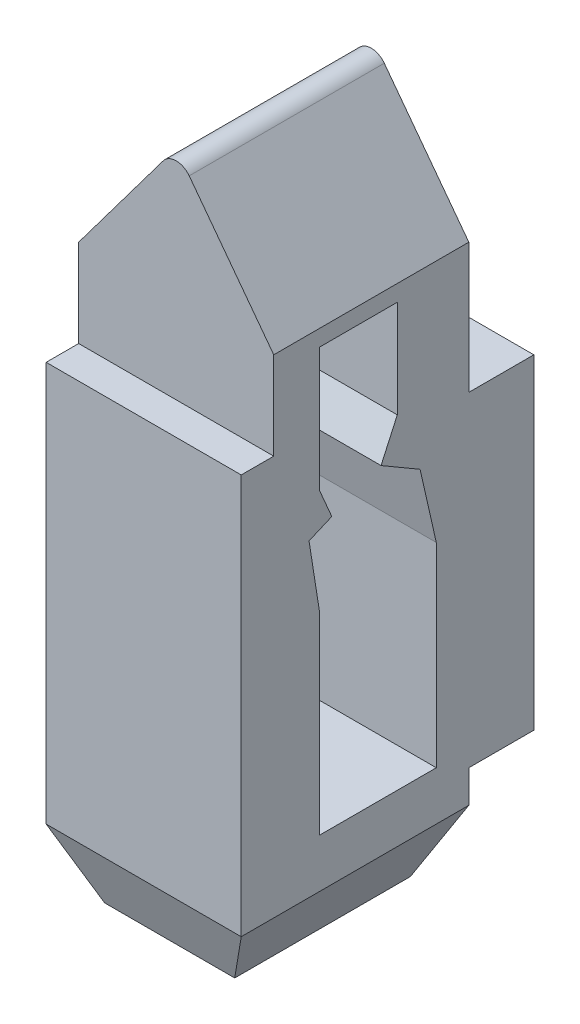
ISO-10303-21;
HEADER;
FILE_DESCRIPTION(('STEP AP214'),'2;1');
FILE_NAME('part.step','',(''),(''),'','','');
FILE_SCHEMA(('AUTOMOTIVE_DESIGN { 1 0 10303 214 1 1 1 1 }'));
ENDSEC;
DATA;
#1=APPLICATION_CONTEXT('core data for automotive mechanical design processes');
#2=APPLICATION_PROTOCOL_DEFINITION('international standard','automotive_design',2000,#1);
#3=PRODUCT_CONTEXT('',#1,'mechanical');
#4=PRODUCT('Part','Part','',(#3));
#5=PRODUCT_RELATED_PRODUCT_CATEGORY('part','',(#4));
#6=PRODUCT_DEFINITION_FORMATION('','',#4);
#7=PRODUCT_DEFINITION_CONTEXT('part definition',#1,'design');
#8=PRODUCT_DEFINITION('design','',#6,#7);
#9=PRODUCT_DEFINITION_SHAPE('','',#8);
#10=(LENGTH_UNIT() NAMED_UNIT(*) SI_UNIT(.MILLI.,.METRE.));
#11=(NAMED_UNIT(*) PLANE_ANGLE_UNIT() SI_UNIT($,.RADIAN.));
#12=(NAMED_UNIT(*) SI_UNIT($,.STERADIAN.) SOLID_ANGLE_UNIT());
#13=UNCERTAINTY_MEASURE_WITH_UNIT(LENGTH_MEASURE(1.E-05),#10,'distance_accuracy_value','');
#14=(GEOMETRIC_REPRESENTATION_CONTEXT(3) GLOBAL_UNCERTAINTY_ASSIGNED_CONTEXT((#13)) GLOBAL_UNIT_ASSIGNED_CONTEXT((#10,
#11,#12)) REPRESENTATION_CONTEXT('',''));
#15=CARTESIAN_POINT('',(0.,0.,0.));
#16=DIRECTION('',(0.,0.,1.));
#17=DIRECTION('',(1.,0.,0.));
#18=AXIS2_PLACEMENT_3D('',#15,#16,#17);
#19=CARTESIAN_POINT('',(-3.,2.,0.));
#20=DIRECTION('',(0.,0.371390676354104,0.928476690885259));
#21=DIRECTION('',(1.,0.,0.));
#22=AXIS2_PLACEMENT_3D('',#19,#20,#21);
#23=PLANE('',#22);
#24=DIRECTION('',(1.,0.,0.));
#25=VECTOR('',#24,1.);
#26=CARTESIAN_POINT('',(0.,2.,0.));
#27=LINE('',#26,#25);
#28=CARTESIAN_POINT('',(-3.,2.,0.));
#29=VERTEX_POINT('',#28);
#30=CARTESIAN_POINT('',(3.,2.,0.));
#31=VERTEX_POINT('',#30);
#32=EDGE_CURVE('E396',#29,#31,#27,.T.);
#33=ORIENTED_EDGE('',*,*,#32,.T.);
#34=DIRECTION('',(-0.42107596053282,-0.84215192106664,0.336860768426856));
#35=VECTOR('',#34,1.);
#36=CARTESIAN_POINT('',(2.5,1.,0.4));
#37=LINE('',#36,#35);
#38=CARTESIAN_POINT('',(2.,0.,0.8));
#39=VERTEX_POINT('',#38);
#40=EDGE_CURVE('E381',#31,#39,#37,.T.);
#41=ORIENTED_EDGE('',*,*,#40,.T.);
#42=DIRECTION('',(1.,0.,0.));
#43=VECTOR('',#42,1.);
#44=CARTESIAN_POINT('',(0.,0.,0.8));
#45=LINE('',#44,#43);
#46=CARTESIAN_POINT('',(-2.,0.,0.8));
#47=VERTEX_POINT('',#46);
#48=EDGE_CURVE('E27',#47,#39,#45,.T.);
#49=ORIENTED_EDGE('',*,*,#48,.F.);
#50=DIRECTION('',(0.42107596053282,-0.84215192106664,0.336860768426856));
#51=VECTOR('',#50,1.);
#52=CARTESIAN_POINT('',(-2.5,1.,0.4));
#53=LINE('',#52,#51);
#54=EDGE_CURVE('E484',#29,#47,#53,.T.);
#55=ORIENTED_EDGE('',*,*,#54,.F.);
#56=EDGE_LOOP('',(#33,#41,#49,#55));
#57=FACE_BOUND('',#56,.T.);
#58=ADVANCED_FACE('F16',(#57),#23,.F.);
#59=CARTESIAN_POINT('',(-3.,2.,7.));
#60=DIRECTION('',(0.,-0.371390676354104,0.928476690885259));
#61=DIRECTION('',(-1.,0.,0.));
#62=AXIS2_PLACEMENT_3D('',#59,#60,#61);
#63=PLANE('',#62);
#64=DIRECTION('',(0.42107596053282,-0.84215192106664,-0.336860768426856));
#65=VECTOR('',#64,1.);
#66=CARTESIAN_POINT('',(-2.5,1.,6.6));
#67=LINE('',#66,#65);
#68=CARTESIAN_POINT('',(-3.,2.,7.));
#69=VERTEX_POINT('',#68);
#70=CARTESIAN_POINT('',(-2.,0.,6.2));
#71=VERTEX_POINT('',#70);
#72=EDGE_CURVE('E382',#69,#71,#67,.T.);
#73=ORIENTED_EDGE('',*,*,#72,.T.);
#74=DIRECTION('',(1.,0.,0.));
#75=VECTOR('',#74,1.);
#76=CARTESIAN_POINT('',(0.,0.,6.2));
#77=LINE('',#76,#75);
#78=CARTESIAN_POINT('',(2.,0.,6.2));
#79=VERTEX_POINT('',#78);
#80=EDGE_CURVE('E11',#71,#79,#77,.T.);
#81=ORIENTED_EDGE('',*,*,#80,.T.);
#82=DIRECTION('',(-0.42107596053282,-0.84215192106664,-0.336860768426856));
#83=VECTOR('',#82,1.);
#84=CARTESIAN_POINT('',(2.5,1.,6.6));
#85=LINE('',#84,#83);
#86=CARTESIAN_POINT('',(3.,2.,7.));
#87=VERTEX_POINT('',#86);
#88=EDGE_CURVE('E605',#87,#79,#85,.T.);
#89=ORIENTED_EDGE('',*,*,#88,.F.);
#90=DIRECTION('',(1.,0.,0.));
#91=VECTOR('',#90,1.);
#92=CARTESIAN_POINT('',(0.,2.,7.));
#93=LINE('',#92,#91);
#94=EDGE_CURVE('E377',#69,#87,#93,.T.);
#95=ORIENTED_EDGE('',*,*,#94,.F.);
#96=EDGE_LOOP('',(#73,#81,#89,#95));
#97=FACE_BOUND('',#96,.T.);
#98=ADVANCED_FACE('F695',(#97),#63,.T.);
#99=CARTESIAN_POINT('',(-2.,0.,0.));
#100=DIRECTION('',(0.,-1.,0.));
#101=DIRECTION('',(0.,0.,-1.));
#102=AXIS2_PLACEMENT_3D('',#99,#100,#101);
#103=PLANE('',#102);
#104=ORIENTED_EDGE('',*,*,#48,.T.);
#105=DIRECTION('',(0.,0.,1.));
#106=VECTOR('',#105,1.);
#107=CARTESIAN_POINT('',(2.,0.,3.5));
#108=LINE('',#107,#106);
#109=EDGE_CURVE('E451',#39,#79,#108,.T.);
#110=ORIENTED_EDGE('',*,*,#109,.T.);
#111=ORIENTED_EDGE('',*,*,#80,.F.);
#112=DIRECTION('',(0.,0.,1.));
#113=VECTOR('',#112,1.);
#114=CARTESIAN_POINT('',(-2.,0.,3.5));
#115=LINE('',#114,#113);
#116=EDGE_CURVE('E446',#47,#71,#115,.T.);
#117=ORIENTED_EDGE('',*,*,#116,.F.);
#118=EDGE_LOOP('',(#104,#110,#111,#117));
#119=FACE_BOUND('',#118,.T.);
#120=ADVANCED_FACE('F709',(#119),#103,.T.);
#121=CARTESIAN_POINT('',(2.,0.,0.));
#122=DIRECTION('',(0.894427190999916,-0.447213595499958,0.));
#123=DIRECTION('',(0.,0.,-1.));
#124=AXIS2_PLACEMENT_3D('',#121,#122,#123);
#125=PLANE('',#124);
#126=ORIENTED_EDGE('',*,*,#40,.F.);
#127=DIRECTION('',(0.,0.,1.));
#128=VECTOR('',#127,1.);
#129=CARTESIAN_POINT('',(3.,2.,3.5));
#130=LINE('',#129,#128);
#131=EDGE_CURVE('E406',#31,#87,#130,.T.);
#132=ORIENTED_EDGE('',*,*,#131,.T.);
#133=ORIENTED_EDGE('',*,*,#88,.T.);
#134=ORIENTED_EDGE('',*,*,#109,.F.);
#135=EDGE_LOOP('',(#126,#132,#133,#134));
#136=FACE_BOUND('',#135,.T.);
#137=ADVANCED_FACE('F691',(#136),#125,.T.);
#138=CARTESIAN_POINT('',(0.,0.,7.));
#139=DIRECTION('',(0.,0.,1.));
#140=DIRECTION('',(1.,0.,0.));
#141=AXIS2_PLACEMENT_3D('',#138,#139,#140);
#142=PLANE('',#141);
#143=DIRECTION('',(0.,1.,0.));
#144=VECTOR('',#143,1.);
#145=CARTESIAN_POINT('',(3.,8.15,7.));
#146=LINE('',#145,#144);
#147=CARTESIAN_POINT('',(3.,14.3,7.));
#148=VERTEX_POINT('',#147);
#149=EDGE_CURVE('E403',#87,#148,#146,.T.);
#150=ORIENTED_EDGE('',*,*,#149,.T.);
#151=DIRECTION('',(-1.,0.,0.));
#152=VECTOR('',#151,1.);
#153=CARTESIAN_POINT('',(0.,14.3,7.));
#154=LINE('',#153,#152);
#155=CARTESIAN_POINT('',(-3.,14.3,7.));
#156=VERTEX_POINT('',#155);
#157=EDGE_CURVE('E373',#148,#156,#154,.T.);
#158=ORIENTED_EDGE('',*,*,#157,.T.);
#159=DIRECTION('',(0.,-1.,0.));
#160=VECTOR('',#159,1.);
#161=CARTESIAN_POINT('',(-3.,8.15,7.));
#162=LINE('',#161,#160);
#163=EDGE_CURVE('E459',#156,#69,#162,.T.);
#164=ORIENTED_EDGE('',*,*,#163,.T.);
#165=ORIENTED_EDGE('',*,*,#94,.T.);
#166=EDGE_LOOP('',(#150,#158,#164,#165));
#167=FACE_BOUND('',#166,.T.);
#168=ADVANCED_FACE('F698',(#167),#142,.T.);
#169=CARTESIAN_POINT('',(-3.,2.,0.));
#170=DIRECTION('',(-0.894427190999916,-0.447213595499958,0.));
#171=DIRECTION('',(-0.447213595499958,0.894427190999916,0.));
#172=AXIS2_PLACEMENT_3D('',#169,#170,#171);
#173=PLANE('',#172);
#174=ORIENTED_EDGE('',*,*,#54,.T.);
#175=ORIENTED_EDGE('',*,*,#116,.T.);
#176=ORIENTED_EDGE('',*,*,#72,.F.);
#177=DIRECTION('',(0.,0.,1.));
#178=VECTOR('',#177,1.);
#179=CARTESIAN_POINT('',(-3.,2.,3.5));
#180=LINE('',#179,#178);
#181=EDGE_CURVE('E547',#29,#69,#180,.T.);
#182=ORIENTED_EDGE('',*,*,#181,.F.);
#183=EDGE_LOOP('',(#174,#175,#176,#182));
#184=FACE_BOUND('',#183,.T.);
#185=ADVANCED_FACE('F706',(#184),#173,.T.);
#186=CARTESIAN_POINT('',(0.,0.,0.));
#187=DIRECTION('',(0.,0.,1.));
#188=DIRECTION('',(1.,0.,0.));
#189=AXIS2_PLACEMENT_3D('',#186,#187,#188);
#190=PLANE('',#189);
#191=ORIENTED_EDGE('',*,*,#32,.F.);
#192=DIRECTION('',(0.,-1.,0.));
#193=VECTOR('',#192,1.);
#194=CARTESIAN_POINT('',(-3.,2.5,0.));
#195=LINE('',#194,#193);
#196=CARTESIAN_POINT('',(-3.,3.,0.));
#197=VERTEX_POINT('',#196);
#198=EDGE_CURVE('E551',#197,#29,#195,.T.);
#199=ORIENTED_EDGE('',*,*,#198,.F.);
#200=DIRECTION('',(-1.,0.,0.));
#201=VECTOR('',#200,1.);
#202=CARTESIAN_POINT('',(-2.5,3.,0.));
#203=LINE('',#202,#201);
#204=CARTESIAN_POINT('',(-2.,3.,0.));
#205=VERTEX_POINT('',#204);
#206=EDGE_CURVE('E369',#205,#197,#203,.T.);
#207=ORIENTED_EDGE('',*,*,#206,.F.);
#208=DIRECTION('',(0.,-1.,0.));
#209=VECTOR('',#208,1.);
#210=CARTESIAN_POINT('',(-2.,7.,0.));
#211=LINE('',#210,#209);
#212=CARTESIAN_POINT('',(-2.,11.,0.));
#213=VERTEX_POINT('',#212);
#214=EDGE_CURVE('E465',#213,#205,#211,.T.);
#215=ORIENTED_EDGE('',*,*,#214,.F.);
#216=DIRECTION('',(-1.,0.,0.));
#217=VECTOR('',#216,1.);
#218=CARTESIAN_POINT('',(0.,11.,0.));
#219=LINE('',#218,#217);
#220=CARTESIAN_POINT('',(2.,11.,0.));
#221=VERTEX_POINT('',#220);
#222=EDGE_CURVE('E387',#221,#213,#219,.T.);
#223=ORIENTED_EDGE('',*,*,#222,.F.);
#224=DIRECTION('',(0.,1.,0.));
#225=VECTOR('',#224,1.);
#226=CARTESIAN_POINT('',(2.,7.,0.));
#227=LINE('',#226,#225);
#228=CARTESIAN_POINT('',(2.,3.,0.));
#229=VERTEX_POINT('',#228);
#230=EDGE_CURVE('E493',#229,#221,#227,.T.);
#231=ORIENTED_EDGE('',*,*,#230,.F.);
#232=DIRECTION('',(-1.,0.,0.));
#233=VECTOR('',#232,1.);
#234=CARTESIAN_POINT('',(2.5,3.,0.));
#235=LINE('',#234,#233);
#236=CARTESIAN_POINT('',(3.,3.,0.));
#237=VERTEX_POINT('',#236);
#238=EDGE_CURVE('E304',#237,#229,#235,.T.);
#239=ORIENTED_EDGE('',*,*,#238,.F.);
#240=DIRECTION('',(0.,1.,0.));
#241=VECTOR('',#240,1.);
#242=CARTESIAN_POINT('',(3.,2.5,0.));
#243=LINE('',#242,#241);
#244=EDGE_CURVE('E443',#31,#237,#243,.T.);
#245=ORIENTED_EDGE('',*,*,#244,.F.);
#246=EDGE_LOOP('',(#191,#199,#207,#215,#223,#231,#239,#245));
#247=FACE_BOUND('',#246,.T.);
#248=ADVANCED_FACE('F715',(#247),#190,.F.);
#249=CARTESIAN_POINT('',(0.,9.5,-1.5));
#250=DIRECTION('',(0.,-1.,0.));
#251=DIRECTION('',(1.,0.,0.));
#252=AXIS2_PLACEMENT_3D('',#249,#250,#251);
#253=CYLINDRICAL_SURFACE('',#252,0.5);
#254=DIRECTION('',(0.,-1.,0.));
#255=VECTOR('',#254,1.);
#256=CARTESIAN_POINT('',(0.5,9.5,-1.5));
#257=LINE('',#256,#255);
#258=CARTESIAN_POINT('',(0.5,11.,-1.5));
#259=VERTEX_POINT('',#258);
#260=CARTESIAN_POINT('',(0.5,8.,-1.5));
#261=VERTEX_POINT('',#260);
#262=EDGE_CURVE('E392',#259,#261,#257,.T.);
#263=ORIENTED_EDGE('',*,*,#262,.F.);
#264=CARTESIAN_POINT('',(0.,11.,-1.5));
#265=DIRECTION('',(0.,-1.,0.));
#266=DIRECTION('',(1.,0.,0.));
#267=AXIS2_PLACEMENT_3D('',#264,#265,#266);
#268=CIRCLE('',#267,0.5);
#269=CARTESIAN_POINT('',(-0.5,11.,-1.5));
#270=VERTEX_POINT('',#269);
#271=EDGE_CURVE('E306',#259,#270,#268,.T.);
#272=ORIENTED_EDGE('',*,*,#271,.T.);
#273=DIRECTION('',(0.,-1.,0.));
#274=VECTOR('',#273,1.);
#275=CARTESIAN_POINT('',(-0.5,9.5,-1.5));
#276=LINE('',#275,#274);
#277=CARTESIAN_POINT('',(-0.5,8.,-1.5));
#278=VERTEX_POINT('',#277);
#279=EDGE_CURVE('E397',#270,#278,#276,.T.);
#280=ORIENTED_EDGE('',*,*,#279,.T.);
#281=CARTESIAN_POINT('',(0.,8.,-1.5));
#282=DIRECTION('',(0.,-1.,0.));
#283=DIRECTION('',(1.,0.,0.));
#284=AXIS2_PLACEMENT_3D('',#281,#282,#283);
#285=CIRCLE('',#284,0.5);
#286=EDGE_CURVE('E545',#261,#278,#285,.T.);
#287=ORIENTED_EDGE('',*,*,#286,.F.);
#288=EDGE_LOOP('',(#263,#272,#280,#287));
#289=FACE_BOUND('',#288,.T.);
#290=ADVANCED_FACE('F18',(#289),#253,.T.);
#291=CARTESIAN_POINT('',(0.,9.5,-1.5));
#292=DIRECTION('',(0.,-1.,0.));
#293=DIRECTION('',(1.,0.,0.));
#294=AXIS2_PLACEMENT_3D('',#291,#292,#293);
#295=CYLINDRICAL_SURFACE('',#294,0.5);
#296=ORIENTED_EDGE('',*,*,#279,.F.);
#297=CARTESIAN_POINT('',(0.,11.,-1.5));
#298=DIRECTION('',(0.,-1.,0.));
#299=DIRECTION('',(1.,0.,0.));
#300=AXIS2_PLACEMENT_3D('',#297,#298,#299);
#301=CIRCLE('',#300,0.5);
#302=CARTESIAN_POINT('',(0.,11.,-2.));
#303=VERTEX_POINT('',#302);
#304=EDGE_CURVE('E311',#270,#303,#301,.T.);
#305=ORIENTED_EDGE('',*,*,#304,.T.);
#306=CARTESIAN_POINT('',(0.,11.,-1.5));
#307=DIRECTION('',(0.,-1.,0.));
#308=DIRECTION('',(1.,0.,0.));
#309=AXIS2_PLACEMENT_3D('',#306,#307,#308);
#310=CIRCLE('',#309,0.5);
#311=EDGE_CURVE('E310',#303,#259,#310,.T.);
#312=ORIENTED_EDGE('',*,*,#311,.T.);
#313=ORIENTED_EDGE('',*,*,#262,.T.);
#314=CARTESIAN_POINT('',(0.,8.,-1.5));
#315=DIRECTION('',(0.,-1.,0.));
#316=DIRECTION('',(1.,0.,0.));
#317=AXIS2_PLACEMENT_3D('',#314,#315,#316);
#318=CIRCLE('',#317,0.5);
#319=EDGE_CURVE('E523',#278,#261,#318,.T.);
#320=ORIENTED_EDGE('',*,*,#319,.F.);
#321=EDGE_LOOP('',(#296,#305,#312,#313,#320));
#322=FACE_BOUND('',#321,.T.);
#323=ADVANCED_FACE('F1038',(#322),#295,.T.);
#324=CARTESIAN_POINT('',(0.,8.,0.));
#325=DIRECTION('',(0.,-1.,0.));
#326=DIRECTION('',(0.,0.,-1.));
#327=AXIS2_PLACEMENT_3D('',#324,#325,#326);
#328=PLANE('',#327);
#329=ORIENTED_EDGE('',*,*,#286,.T.);
#330=ORIENTED_EDGE('',*,*,#319,.T.);
#331=EDGE_LOOP('',(#329,#330));
#332=FACE_BOUND('',#331,.T.);
#333=ADVANCED_FACE('F995',(#332),#328,.T.);
#334=CARTESIAN_POINT('',(-3.,13.,0.));
#335=DIRECTION('',(0.,1.,0.));
#336=DIRECTION('',(1.,0.,0.));
#337=AXIS2_PLACEMENT_3D('',#334,#335,#336);
#338=PLANE('',#337);
#339=DIRECTION('',(0.,0.,-1.));
#340=VECTOR('',#339,1.);
#341=CARTESIAN_POINT('',(-3.,13.,-1.));
#342=LINE('',#341,#340);
#343=CARTESIAN_POINT('',(-3.,13.,0.));
#344=VERTEX_POINT('',#343);
#345=CARTESIAN_POINT('',(-3.,13.,-2.));
#346=VERTEX_POINT('',#345);
#347=EDGE_CURVE('E346',#344,#346,#342,.T.);
#348=ORIENTED_EDGE('',*,*,#347,.F.);
#349=DIRECTION('',(1.,0.,0.));
#350=VECTOR('',#349,1.);
#351=CARTESIAN_POINT('',(0.,13.,0.));
#352=LINE('',#351,#350);
#353=CARTESIAN_POINT('',(3.,13.,0.));
#354=VERTEX_POINT('',#353);
#355=EDGE_CURVE('E542',#344,#354,#352,.T.);
#356=ORIENTED_EDGE('',*,*,#355,.T.);
#357=DIRECTION('',(0.,0.,-1.));
#358=VECTOR('',#357,1.);
#359=CARTESIAN_POINT('',(3.,13.,-1.));
#360=LINE('',#359,#358);
#361=CARTESIAN_POINT('',(3.,13.,-2.));
#362=VERTEX_POINT('',#361);
#363=EDGE_CURVE('E345',#354,#362,#360,.T.);
#364=ORIENTED_EDGE('',*,*,#363,.T.);
#365=DIRECTION('',(1.,0.,0.));
#366=VECTOR('',#365,1.);
#367=CARTESIAN_POINT('',(0.,13.,-2.));
#368=LINE('',#367,#366);
#369=EDGE_CURVE('E546',#346,#362,#368,.T.);
#370=ORIENTED_EDGE('',*,*,#369,.F.);
#371=EDGE_LOOP('',(#348,#356,#364,#370));
#372=FACE_BOUND('',#371,.T.);
#373=ADVANCED_FACE('F740',(#372),#338,.T.);
#374=CARTESIAN_POINT('',(0.,0.,0.));
#375=DIRECTION('',(0.,0.,1.));
#376=DIRECTION('',(1.,0.,0.));
#377=AXIS2_PLACEMENT_3D('',#374,#375,#376);
#378=PLANE('',#377);
#379=ORIENTED_EDGE('',*,*,#355,.F.);
#380=DIRECTION('',(0.,-1.,0.));
#381=VECTOR('',#380,1.);
#382=CARTESIAN_POINT('',(-3.,15.,0.));
#383=LINE('',#382,#381);
#384=CARTESIAN_POINT('',(-3.,17.,0.));
#385=VERTEX_POINT('',#384);
#386=EDGE_CURVE('E298',#385,#344,#383,.T.);
#387=ORIENTED_EDGE('',*,*,#386,.F.);
#388=DIRECTION('',(-0.6,-0.8,0.));
#389=VECTOR('',#388,1.);
#390=CARTESIAN_POINT('',(-1.7,18.7333333333,0.));
#391=LINE('',#390,#389);
#392=CARTESIAN_POINT('',(-0.4,20.4666666667,0.));
#393=VERTEX_POINT('',#392);
#394=EDGE_CURVE('E351',#393,#385,#391,.T.);
#395=ORIENTED_EDGE('',*,*,#394,.F.);
#396=CARTESIAN_POINT('',(0.,20.1666666667,0.));
#397=DIRECTION('',(0.,0.,1.));
#398=DIRECTION('',(1.,0.,0.));
#399=AXIS2_PLACEMENT_3D('',#396,#397,#398);
#400=CIRCLE('',#399,0.5);
#401=CARTESIAN_POINT('',(0.4,20.4666666667,0.));
#402=VERTEX_POINT('',#401);
#403=EDGE_CURVE('E364',#402,#393,#400,.T.);
#404=ORIENTED_EDGE('',*,*,#403,.F.);
#405=DIRECTION('',(-0.6,0.8,0.));
#406=VECTOR('',#405,1.);
#407=CARTESIAN_POINT('',(1.7,18.7333333333,0.));
#408=LINE('',#407,#406);
#409=CARTESIAN_POINT('',(3.,17.,0.));
#410=VERTEX_POINT('',#409);
#411=EDGE_CURVE('E541',#410,#402,#408,.T.);
#412=ORIENTED_EDGE('',*,*,#411,.F.);
#413=DIRECTION('',(0.,1.,0.));
#414=VECTOR('',#413,1.);
#415=CARTESIAN_POINT('',(3.,15.,0.));
#416=LINE('',#415,#414);
#417=EDGE_CURVE('E323',#354,#410,#416,.T.);
#418=ORIENTED_EDGE('',*,*,#417,.F.);
#419=EDGE_LOOP('',(#379,#387,#395,#404,#412,#418));
#420=FACE_BOUND('',#419,.T.);
#421=ADVANCED_FACE('F737',(#420),#378,.F.);
#422=CARTESIAN_POINT('',(0.,0.,-2.));
#423=DIRECTION('',(0.,0.,-1.));
#424=DIRECTION('',(0.,-1.,0.));
#425=AXIS2_PLACEMENT_3D('',#422,#423,#424);
#426=PLANE('',#425);
#427=DIRECTION('',(0.,1.,0.));
#428=VECTOR('',#427,1.);
#429=CARTESIAN_POINT('',(-3.,8.,-2.));
#430=LINE('',#429,#428);
#431=CARTESIAN_POINT('',(-3.,3.,-2.));
#432=VERTEX_POINT('',#431);
#433=EDGE_CURVE('E341',#432,#346,#430,.T.);
#434=ORIENTED_EDGE('',*,*,#433,.T.);
#435=ORIENTED_EDGE('',*,*,#369,.T.);
#436=DIRECTION('',(0.,-1.,0.));
#437=VECTOR('',#436,1.);
#438=CARTESIAN_POINT('',(3.,8.,-2.));
#439=LINE('',#438,#437);
#440=CARTESIAN_POINT('',(3.,3.,-2.));
#441=VERTEX_POINT('',#440);
#442=EDGE_CURVE('E526',#362,#441,#439,.T.);
#443=ORIENTED_EDGE('',*,*,#442,.T.);
#444=DIRECTION('',(-1.,0.,0.));
#445=VECTOR('',#444,1.);
#446=CARTESIAN_POINT('',(2.5,3.,-2.));
#447=LINE('',#446,#445);
#448=CARTESIAN_POINT('',(2.,3.,-2.));
#449=VERTEX_POINT('',#448);
#450=EDGE_CURVE('E300',#441,#449,#447,.T.);
#451=ORIENTED_EDGE('',*,*,#450,.T.);
#452=DIRECTION('',(0.,1.,0.));
#453=VECTOR('',#452,1.);
#454=CARTESIAN_POINT('',(2.,7.,-2.));
#455=LINE('',#454,#453);
#456=CARTESIAN_POINT('',(2.,11.,-2.));
#457=VERTEX_POINT('',#456);
#458=EDGE_CURVE('E455',#449,#457,#455,.T.);
#459=ORIENTED_EDGE('',*,*,#458,.T.);
#460=DIRECTION('',(-1.,0.,0.));
#461=VECTOR('',#460,1.);
#462=CARTESIAN_POINT('',(1.,11.,-2.));
#463=LINE('',#462,#461);
#464=EDGE_CURVE('E419',#457,#303,#463,.T.);
#465=ORIENTED_EDGE('',*,*,#464,.T.);
#466=DIRECTION('',(-1.,0.,0.));
#467=VECTOR('',#466,1.);
#468=CARTESIAN_POINT('',(-1.,11.,-2.));
#469=LINE('',#468,#467);
#470=CARTESIAN_POINT('',(-2.,11.,-2.));
#471=VERTEX_POINT('',#470);
#472=EDGE_CURVE('E383',#303,#471,#469,.T.);
#473=ORIENTED_EDGE('',*,*,#472,.T.);
#474=DIRECTION('',(0.,-1.,0.));
#475=VECTOR('',#474,1.);
#476=CARTESIAN_POINT('',(-2.,7.,-2.));
#477=LINE('',#476,#475);
#478=CARTESIAN_POINT('',(-2.,3.,-2.));
#479=VERTEX_POINT('',#478);
#480=EDGE_CURVE('E625',#471,#479,#477,.T.);
#481=ORIENTED_EDGE('',*,*,#480,.T.);
#482=DIRECTION('',(-1.,0.,0.));
#483=VECTOR('',#482,1.);
#484=CARTESIAN_POINT('',(-2.5,3.,-2.));
#485=LINE('',#484,#483);
#486=EDGE_CURVE('E372',#479,#432,#485,.T.);
#487=ORIENTED_EDGE('',*,*,#486,.T.);
#488=EDGE_LOOP('',(#434,#435,#443,#451,#459,#465,#473,#481,#487));
#489=FACE_BOUND('',#488,.T.);
#490=ADVANCED_FACE('F632',(#489),#426,.T.);
#491=CARTESIAN_POINT('',(3.,3.,0.));
#492=DIRECTION('',(0.,-1.,0.));
#493=DIRECTION('',(0.,0.,-1.));
#494=AXIS2_PLACEMENT_3D('',#491,#492,#493);
#495=PLANE('',#494);
#496=DIRECTION('',(0.,0.,-1.));
#497=VECTOR('',#496,1.);
#498=CARTESIAN_POINT('',(-2.,3.,-1.));
#499=LINE('',#498,#497);
#500=EDGE_CURVE('E469',#205,#479,#499,.T.);
#501=ORIENTED_EDGE('',*,*,#500,.F.);
#502=ORIENTED_EDGE('',*,*,#206,.T.);
#503=DIRECTION('',(0.,0.,-1.));
#504=VECTOR('',#503,1.);
#505=CARTESIAN_POINT('',(-3.,3.,-1.));
#506=LINE('',#505,#504);
#507=EDGE_CURVE('E402',#197,#432,#506,.T.);
#508=ORIENTED_EDGE('',*,*,#507,.T.);
#509=ORIENTED_EDGE('',*,*,#486,.F.);
#510=EDGE_LOOP('',(#501,#502,#508,#509));
#511=FACE_BOUND('',#510,.T.);
#512=ADVANCED_FACE('F642',(#511),#495,.T.);
#513=CARTESIAN_POINT('',(-3.,14.3,6.));
#514=DIRECTION('',(0.,-1.,0.));
#515=DIRECTION('',(0.,0.,-1.));
#516=AXIS2_PLACEMENT_3D('',#513,#514,#515);
#517=PLANE('',#516);
#518=DIRECTION('',(0.,0.,1.));
#519=VECTOR('',#518,1.);
#520=CARTESIAN_POINT('',(3.,14.3,6.5));
#521=LINE('',#520,#519);
#522=CARTESIAN_POINT('',(3.,14.3,6.));
#523=VERTEX_POINT('',#522);
#524=EDGE_CURVE('E407',#523,#148,#521,.T.);
#525=ORIENTED_EDGE('',*,*,#524,.F.);
#526=DIRECTION('',(-1.,0.,0.));
#527=VECTOR('',#526,1.);
#528=CARTESIAN_POINT('',(0.,14.3,6.));
#529=LINE('',#528,#527);
#530=CARTESIAN_POINT('',(-3.,14.3,6.));
#531=VERTEX_POINT('',#530);
#532=EDGE_CURVE('E350',#523,#531,#529,.T.);
#533=ORIENTED_EDGE('',*,*,#532,.T.);
#534=DIRECTION('',(0.,0.,1.));
#535=VECTOR('',#534,1.);
#536=CARTESIAN_POINT('',(-3.,14.3,6.5));
#537=LINE('',#536,#535);
#538=EDGE_CURVE('E355',#531,#156,#537,.T.);
#539=ORIENTED_EDGE('',*,*,#538,.T.);
#540=ORIENTED_EDGE('',*,*,#157,.F.);
#541=EDGE_LOOP('',(#525,#533,#539,#540));
#542=FACE_BOUND('',#541,.T.);
#543=ADVANCED_FACE('F725',(#542),#517,.F.);
#544=CARTESIAN_POINT('',(0.,0.,6.));
#545=DIRECTION('',(0.,0.,1.));
#546=DIRECTION('',(1.,0.,0.));
#547=AXIS2_PLACEMENT_3D('',#544,#545,#546);
#548=PLANE('',#547);
#549=DIRECTION('',(0.,1.,0.));
#550=VECTOR('',#549,1.);
#551=CARTESIAN_POINT('',(3.,15.65,6.));
#552=LINE('',#551,#550);
#553=CARTESIAN_POINT('',(3.,17.,6.));
#554=VERTEX_POINT('',#553);
#555=EDGE_CURVE('E322',#523,#554,#552,.T.);
#556=ORIENTED_EDGE('',*,*,#555,.T.);
#557=DIRECTION('',(-0.6,0.8,0.));
#558=VECTOR('',#557,1.);
#559=CARTESIAN_POINT('',(1.7,18.7333333333,6.));
#560=LINE('',#559,#558);
#561=CARTESIAN_POINT('',(0.4,20.4666666667,6.));
#562=VERTEX_POINT('',#561);
#563=EDGE_CURVE('E538',#554,#562,#560,.T.);
#564=ORIENTED_EDGE('',*,*,#563,.T.);
#565=CARTESIAN_POINT('',(0.,20.1666666667,6.));
#566=DIRECTION('',(0.,0.,1.));
#567=DIRECTION('',(1.,0.,0.));
#568=AXIS2_PLACEMENT_3D('',#565,#566,#567);
#569=CIRCLE('',#568,0.5);
#570=CARTESIAN_POINT('',(-0.4,20.4666666667,6.));
#571=VERTEX_POINT('',#570);
#572=EDGE_CURVE('E611',#562,#571,#569,.T.);
#573=ORIENTED_EDGE('',*,*,#572,.T.);
#574=DIRECTION('',(-0.6,-0.8,0.));
#575=VECTOR('',#574,1.);
#576=CARTESIAN_POINT('',(-1.7,18.7333333333,6.));
#577=LINE('',#576,#575);
#578=CARTESIAN_POINT('',(-3.,17.,6.));
#579=VERTEX_POINT('',#578);
#580=EDGE_CURVE('E347',#571,#579,#577,.T.);
#581=ORIENTED_EDGE('',*,*,#580,.T.);
#582=DIRECTION('',(0.,-1.,0.));
#583=VECTOR('',#582,1.);
#584=CARTESIAN_POINT('',(-3.,15.65,6.));
#585=LINE('',#584,#583);
#586=EDGE_CURVE('E299',#579,#531,#585,.T.);
#587=ORIENTED_EDGE('',*,*,#586,.T.);
#588=ORIENTED_EDGE('',*,*,#532,.F.);
#589=EDGE_LOOP('',(#556,#564,#573,#581,#587,#588));
#590=FACE_BOUND('',#589,.T.);
#591=ADVANCED_FACE('F729',(#590),#548,.T.);
#592=CARTESIAN_POINT('',(-3.,17.,0.));
#593=DIRECTION('',(0.8,-0.6,0.));
#594=DIRECTION('',(0.,0.,-1.));
#595=AXIS2_PLACEMENT_3D('',#592,#593,#594);
#596=PLANE('',#595);
#597=DIRECTION('',(0.,0.,1.));
#598=VECTOR('',#597,1.);
#599=CARTESIAN_POINT('',(-0.4,20.4666666667,3.));
#600=LINE('',#599,#598);
#601=EDGE_CURVE('E368',#393,#571,#600,.T.);
#602=ORIENTED_EDGE('',*,*,#601,.F.);
#603=ORIENTED_EDGE('',*,*,#394,.T.);
#604=DIRECTION('',(0.,0.,1.));
#605=VECTOR('',#604,1.);
#606=CARTESIAN_POINT('',(-3.,17.,3.));
#607=LINE('',#606,#605);
#608=EDGE_CURVE('E295',#385,#579,#607,.T.);
#609=ORIENTED_EDGE('',*,*,#608,.T.);
#610=ORIENTED_EDGE('',*,*,#580,.F.);
#611=EDGE_LOOP('',(#602,#603,#609,#610));
#612=FACE_BOUND('',#611,.T.);
#613=ADVANCED_FACE('F733',(#612),#596,.F.);
#614=CARTESIAN_POINT('',(0.4,20.4666666667,0.));
#615=DIRECTION('',(-0.8,-0.6,0.));
#616=DIRECTION('',(-0.6,0.8,0.));
#617=AXIS2_PLACEMENT_3D('',#614,#615,#616);
#618=PLANE('',#617);
#619=DIRECTION('',(0.,0.,1.));
#620=VECTOR('',#619,1.);
#621=CARTESIAN_POINT('',(3.,17.,3.));
#622=LINE('',#621,#620);
#623=EDGE_CURVE('E318',#410,#554,#622,.T.);
#624=ORIENTED_EDGE('',*,*,#623,.F.);
#625=ORIENTED_EDGE('',*,*,#411,.T.);
#626=DIRECTION('',(0.,0.,1.));
#627=VECTOR('',#626,1.);
#628=CARTESIAN_POINT('',(0.4,20.4666666667,3.));
#629=LINE('',#628,#627);
#630=EDGE_CURVE('E303',#402,#562,#629,.T.);
#631=ORIENTED_EDGE('',*,*,#630,.T.);
#632=ORIENTED_EDGE('',*,*,#563,.F.);
#633=EDGE_LOOP('',(#624,#625,#631,#632));
#634=FACE_BOUND('',#633,.T.);
#635=ADVANCED_FACE('F879',(#634),#618,.F.);
#636=CARTESIAN_POINT('',(0.,20.1666666667,3.));
#637=DIRECTION('',(0.,0.,1.));
#638=DIRECTION('',(0.8,0.6,0.));
#639=AXIS2_PLACEMENT_3D('',#636,#637,#638);
#640=CYLINDRICAL_SURFACE('',#639,0.5);
#641=ORIENTED_EDGE('',*,*,#630,.F.);
#642=ORIENTED_EDGE('',*,*,#403,.T.);
#643=ORIENTED_EDGE('',*,*,#601,.T.);
#644=ORIENTED_EDGE('',*,*,#572,.F.);
#645=EDGE_LOOP('',(#641,#642,#643,#644));
#646=FACE_BOUND('',#645,.T.);
#647=ADVANCED_FACE('F874',(#646),#640,.T.);
#648=CARTESIAN_POINT('',(3.,3.,0.));
#649=DIRECTION('',(0.,-1.,0.));
#650=DIRECTION('',(0.,0.,-1.));
#651=AXIS2_PLACEMENT_3D('',#648,#649,#650);
#652=PLANE('',#651);
#653=DIRECTION('',(0.,0.,-1.));
#654=VECTOR('',#653,1.);
#655=CARTESIAN_POINT('',(3.,3.,-1.));
#656=LINE('',#655,#654);
#657=EDGE_CURVE('E567',#237,#441,#656,.T.);
#658=ORIENTED_EDGE('',*,*,#657,.F.);
#659=ORIENTED_EDGE('',*,*,#238,.T.);
#660=DIRECTION('',(0.,0.,-1.));
#661=VECTOR('',#660,1.);
#662=CARTESIAN_POINT('',(2.,3.,-1.));
#663=LINE('',#662,#661);
#664=EDGE_CURVE('E386',#229,#449,#663,.T.);
#665=ORIENTED_EDGE('',*,*,#664,.T.);
#666=ORIENTED_EDGE('',*,*,#450,.F.);
#667=EDGE_LOOP('',(#658,#659,#665,#666));
#668=FACE_BOUND('',#667,.T.);
#669=ADVANCED_FACE('F746',(#668),#652,.T.);
#670=CARTESIAN_POINT('',(2.,11.,0.));
#671=DIRECTION('',(1.,0.,0.));
#672=DIRECTION('',(0.,1.,0.));
#673=AXIS2_PLACEMENT_3D('',#670,#671,#672);
#674=PLANE('',#673);
#675=ORIENTED_EDGE('',*,*,#664,.F.);
#676=ORIENTED_EDGE('',*,*,#230,.T.);
#677=DIRECTION('',(0.,0.,-1.));
#678=VECTOR('',#677,1.);
#679=CARTESIAN_POINT('',(2.,11.,-1.));
#680=LINE('',#679,#678);
#681=EDGE_CURVE('E409',#221,#457,#680,.T.);
#682=ORIENTED_EDGE('',*,*,#681,.T.);
#683=ORIENTED_EDGE('',*,*,#458,.F.);
#684=EDGE_LOOP('',(#675,#676,#682,#683));
#685=FACE_BOUND('',#684,.T.);
#686=ADVANCED_FACE('F937',(#685),#674,.F.);
#687=CARTESIAN_POINT('',(2.,11.,0.));
#688=DIRECTION('',(0.,-1.,0.));
#689=DIRECTION('',(0.,0.,-1.));
#690=AXIS2_PLACEMENT_3D('',#687,#688,#689);
#691=PLANE('',#690);
#692=ORIENTED_EDGE('',*,*,#304,.F.);
#693=ORIENTED_EDGE('',*,*,#271,.F.);
#694=ORIENTED_EDGE('',*,*,#311,.F.);
#695=ORIENTED_EDGE('',*,*,#464,.F.);
#696=ORIENTED_EDGE('',*,*,#681,.F.);
#697=ORIENTED_EDGE('',*,*,#222,.T.);
#698=DIRECTION('',(0.,0.,-1.));
#699=VECTOR('',#698,1.);
#700=CARTESIAN_POINT('',(-2.,11.,-1.));
#701=LINE('',#700,#699);
#702=EDGE_CURVE('E470',#213,#471,#701,.T.);
#703=ORIENTED_EDGE('',*,*,#702,.T.);
#704=ORIENTED_EDGE('',*,*,#472,.F.);
#705=EDGE_LOOP('',(#692,#693,#694,#695,#696,#697,#703,#704));
#706=FACE_BOUND('',#705,.T.);
#707=ADVANCED_FACE('F942',(#706),#691,.T.);
#708=CARTESIAN_POINT('',(-2.,3.,0.));
#709=DIRECTION('',(-1.,0.,0.));
#710=DIRECTION('',(0.,0.,1.));
#711=AXIS2_PLACEMENT_3D('',#708,#709,#710);
#712=PLANE('',#711);
#713=ORIENTED_EDGE('',*,*,#702,.F.);
#714=ORIENTED_EDGE('',*,*,#214,.T.);
#715=ORIENTED_EDGE('',*,*,#500,.T.);
#716=ORIENTED_EDGE('',*,*,#480,.F.);
#717=EDGE_LOOP('',(#713,#714,#715,#716));
#718=FACE_BOUND('',#717,.T.);
#719=ADVANCED_FACE('F915',(#718),#712,.F.);
#720=CARTESIAN_POINT('',(3.,2.,0.));
#721=DIRECTION('',(1.,0.,0.));
#722=DIRECTION('',(0.,1.,0.));
#723=AXIS2_PLACEMENT_3D('',#720,#721,#722);
#724=PLANE('',#723);
#725=DIRECTION('',(0.,0.,-1.));
#726=VECTOR('',#725,1.);
#727=CARTESIAN_POINT('',(3.,16.5,3.4));
#728=LINE('',#727,#726);
#729=CARTESIAN_POINT('',(3.,16.5,4.6));
#730=VERTEX_POINT('',#729);
#731=CARTESIAN_POINT('',(3.,16.5,2.2));
#732=VERTEX_POINT('',#731);
#733=EDGE_CURVE('E474',#730,#732,#728,.T.);
#734=ORIENTED_EDGE('',*,*,#733,.T.);
#735=DIRECTION('',(0.,-1.,0.));
#736=VECTOR('',#735,1.);
#737=CARTESIAN_POINT('',(3.,15.,2.2));
#738=LINE('',#737,#736);
#739=CARTESIAN_POINT('',(3.,13.5,2.2));
#740=VERTEX_POINT('',#739);
#741=EDGE_CURVE('E398',#732,#740,#738,.T.);
#742=ORIENTED_EDGE('',*,*,#741,.T.);
#743=DIRECTION('',(0.,-0.910366477462742,0.413802944300882));
#744=VECTOR('',#743,1.);
#745=CARTESIAN_POINT('',(3.,12.95,2.45));
#746=LINE('',#745,#744);
#747=CARTESIAN_POINT('',(3.,12.4,2.7));
#748=VERTEX_POINT('',#747);
#749=EDGE_CURVE('E333',#740,#748,#746,.T.);
#750=ORIENTED_EDGE('',*,*,#749,.T.);
#751=DIRECTION('',(0.,-0.503871025524211,-0.863778900898361));
#752=VECTOR('',#751,1.);
#753=CARTESIAN_POINT('',(3.,12.05,2.1));
#754=LINE('',#753,#752);
#755=CARTESIAN_POINT('',(3.,11.7,1.5));
#756=VERTEX_POINT('',#755);
#757=EDGE_CURVE('E433',#748,#756,#754,.T.);
#758=ORIENTED_EDGE('',*,*,#757,.T.);
#759=DIRECTION('',(0.,-0.97513285579143,-0.221621103589098));
#760=VECTOR('',#759,1.);
#761=CARTESIAN_POINT('',(3.,10.6,1.25));
#762=LINE('',#761,#760);
#763=CARTESIAN_POINT('',(3.,9.5,1.));
#764=VERTEX_POINT('',#763);
#765=EDGE_CURVE('E583',#756,#764,#762,.T.);
#766=ORIENTED_EDGE('',*,*,#765,.T.);
#767=DIRECTION('',(0.,-1.,0.));
#768=VECTOR('',#767,1.);
#769=CARTESIAN_POINT('',(3.,6.5,1.));
#770=LINE('',#769,#768);
#771=CARTESIAN_POINT('',(3.,3.5,1.));
#772=VERTEX_POINT('',#771);
#773=EDGE_CURVE('E462',#764,#772,#770,.T.);
#774=ORIENTED_EDGE('',*,*,#773,.T.);
#775=DIRECTION('',(0.,0.,1.));
#776=VECTOR('',#775,1.);
#777=CARTESIAN_POINT('',(3.,3.5,2.8));
#778=LINE('',#777,#776);
#779=CARTESIAN_POINT('',(3.,3.5,4.6));
#780=VERTEX_POINT('',#779);
#781=EDGE_CURVE('E506',#772,#780,#778,.T.);
#782=ORIENTED_EDGE('',*,*,#781,.T.);
#783=DIRECTION('',(0.,1.,0.));
#784=VECTOR('',#783,1.);
#785=CARTESIAN_POINT('',(3.,6.5,4.6));
#786=LINE('',#785,#784);
#787=CARTESIAN_POINT('',(3.,9.5,4.6));
#788=VERTEX_POINT('',#787);
#789=EDGE_CURVE('E340',#780,#788,#786,.T.);
#790=ORIENTED_EDGE('',*,*,#789,.T.);
#791=DIRECTION('',(0.,0.987877125404495,0.155237833992078));
#792=VECTOR('',#791,1.);
#793=CARTESIAN_POINT('',(3.,10.5,4.75714285714));
#794=LINE('',#793,#792);
#795=CARTESIAN_POINT('',(3.,11.5,4.91428571429));
#796=VERTEX_POINT('',#795);
#797=EDGE_CURVE('E360',#788,#796,#794,.T.);
#798=ORIENTED_EDGE('',*,*,#797,.T.);
#799=DIRECTION('',(0.,0.393919298579047,-0.91914503001811));
#800=VECTOR('',#799,1.);
#801=CARTESIAN_POINT('',(3.,11.65,4.56428571429));
#802=LINE('',#801,#800);
#803=CARTESIAN_POINT('',(3.,11.8,4.21428571429));
#804=VERTEX_POINT('',#803);
#805=EDGE_CURVE('E312',#796,#804,#802,.T.);
#806=ORIENTED_EDGE('',*,*,#805,.T.);
#807=DIRECTION('',(0.,0.91914503001811,0.393919298579047));
#808=VECTOR('',#807,1.);
#809=CARTESIAN_POINT('',(3.,12.25,4.40714285714));
#810=LINE('',#809,#808);
#811=CARTESIAN_POINT('',(3.,12.7,4.6));
#812=VERTEX_POINT('',#811);
#813=EDGE_CURVE('E328',#804,#812,#810,.T.);
#814=ORIENTED_EDGE('',*,*,#813,.T.);
#815=DIRECTION('',(0.,1.,0.));
#816=VECTOR('',#815,1.);
#817=CARTESIAN_POINT('',(3.,14.6,4.6));
#818=LINE('',#817,#816);
#819=EDGE_CURVE('E552',#812,#730,#818,.T.);
#820=ORIENTED_EDGE('',*,*,#819,.T.);
#821=EDGE_LOOP('',(#734,#742,#750,#758,#766,#774,#782,#790,#798,#806,#814,#820));
#822=FACE_BOUND('',#821,.T.);
#823=ORIENTED_EDGE('',*,*,#363,.F.);
#824=ORIENTED_EDGE('',*,*,#417,.T.);
#825=ORIENTED_EDGE('',*,*,#623,.T.);
#826=ORIENTED_EDGE('',*,*,#555,.F.);
#827=ORIENTED_EDGE('',*,*,#524,.T.);
#828=ORIENTED_EDGE('',*,*,#149,.F.);
#829=ORIENTED_EDGE('',*,*,#131,.F.);
#830=ORIENTED_EDGE('',*,*,#244,.T.);
#831=ORIENTED_EDGE('',*,*,#657,.T.);
#832=ORIENTED_EDGE('',*,*,#442,.F.);
#833=EDGE_LOOP('',(#823,#824,#825,#826,#827,#828,#829,#830,#831,#832));
#834=FACE_BOUND('',#833,.T.);
#835=ADVANCED_FACE('F720',(#822,#834),#724,.T.);
#836=CARTESIAN_POINT('',(-3.,17.,0.));
#837=DIRECTION('',(-1.,0.,0.));
#838=DIRECTION('',(0.,0.,1.));
#839=AXIS2_PLACEMENT_3D('',#836,#837,#838);
#840=PLANE('',#839);
#841=DIRECTION('',(0.,1.,0.));
#842=VECTOR('',#841,1.);
#843=CARTESIAN_POINT('',(-3.,14.6,4.6));
#844=LINE('',#843,#842);
#845=CARTESIAN_POINT('',(-3.,12.7,4.6));
#846=VERTEX_POINT('',#845);
#847=CARTESIAN_POINT('',(-3.,16.5,4.6));
#848=VERTEX_POINT('',#847);
#849=EDGE_CURVE('E576',#846,#848,#844,.T.);
#850=ORIENTED_EDGE('',*,*,#849,.F.);
#851=DIRECTION('',(0.,0.91914503001811,0.393919298579047));
#852=VECTOR('',#851,1.);
#853=CARTESIAN_POINT('',(-3.,12.25,4.40714285714));
#854=LINE('',#853,#852);
#855=CARTESIAN_POINT('',(-3.,11.8,4.21428571429));
#856=VERTEX_POINT('',#855);
#857=EDGE_CURVE('E329',#856,#846,#854,.T.);
#858=ORIENTED_EDGE('',*,*,#857,.F.);
#859=DIRECTION('',(0.,0.393919298579047,-0.91914503001811));
#860=VECTOR('',#859,1.);
#861=CARTESIAN_POINT('',(-3.,11.65,4.56428571429));
#862=LINE('',#861,#860);
#863=CARTESIAN_POINT('',(-3.,11.5,4.91428571429));
#864=VERTEX_POINT('',#863);
#865=EDGE_CURVE('E358',#864,#856,#862,.T.);
#866=ORIENTED_EDGE('',*,*,#865,.F.);
#867=DIRECTION('',(0.,0.987877125404495,0.155237833992078));
#868=VECTOR('',#867,1.);
#869=CARTESIAN_POINT('',(-3.,10.5,4.75714285714));
#870=LINE('',#869,#868);
#871=CARTESIAN_POINT('',(-3.,9.5,4.6));
#872=VERTEX_POINT('',#871);
#873=EDGE_CURVE('E335',#872,#864,#870,.T.);
#874=ORIENTED_EDGE('',*,*,#873,.F.);
#875=DIRECTION('',(0.,1.,0.));
#876=VECTOR('',#875,1.);
#877=CARTESIAN_POINT('',(-3.,6.5,4.6));
#878=LINE('',#877,#876);
#879=CARTESIAN_POINT('',(-3.,3.5,4.6));
#880=VERTEX_POINT('',#879);
#881=EDGE_CURVE('E293',#880,#872,#878,.T.);
#882=ORIENTED_EDGE('',*,*,#881,.F.);
#883=DIRECTION('',(0.,0.,1.));
#884=VECTOR('',#883,1.);
#885=CARTESIAN_POINT('',(-3.,3.5,2.8));
#886=LINE('',#885,#884);
#887=CARTESIAN_POINT('',(-3.,3.5,1.));
#888=VERTEX_POINT('',#887);
#889=EDGE_CURVE('E502',#888,#880,#886,.T.);
#890=ORIENTED_EDGE('',*,*,#889,.F.);
#891=DIRECTION('',(0.,-1.,0.));
#892=VECTOR('',#891,1.);
#893=CARTESIAN_POINT('',(-3.,6.5,1.));
#894=LINE('',#893,#892);
#895=CARTESIAN_POINT('',(-3.,9.5,1.));
#896=VERTEX_POINT('',#895);
#897=EDGE_CURVE('E391',#896,#888,#894,.T.);
#898=ORIENTED_EDGE('',*,*,#897,.F.);
#899=DIRECTION('',(0.,-0.97513285579143,-0.221621103589098));
#900=VECTOR('',#899,1.);
#901=CARTESIAN_POINT('',(-3.,10.6,1.25));
#902=LINE('',#901,#900);
#903=CARTESIAN_POINT('',(-3.,11.7,1.5));
#904=VERTEX_POINT('',#903);
#905=EDGE_CURVE('E586',#904,#896,#902,.T.);
#906=ORIENTED_EDGE('',*,*,#905,.F.);
#907=DIRECTION('',(0.,-0.503871025524211,-0.863778900898361));
#908=VECTOR('',#907,1.);
#909=CARTESIAN_POINT('',(-3.,12.05,2.1));
#910=LINE('',#909,#908);
#911=CARTESIAN_POINT('',(-3.,12.4,2.7));
#912=VERTEX_POINT('',#911);
#913=EDGE_CURVE('E436',#912,#904,#910,.T.);
#914=ORIENTED_EDGE('',*,*,#913,.F.);
#915=DIRECTION('',(0.,-0.910366477462742,0.413802944300882));
#916=VECTOR('',#915,1.);
#917=CARTESIAN_POINT('',(-3.,12.95,2.45));
#918=LINE('',#917,#916);
#919=CARTESIAN_POINT('',(-3.,13.5,2.2));
#920=VERTEX_POINT('',#919);
#921=EDGE_CURVE('E330',#920,#912,#918,.T.);
#922=ORIENTED_EDGE('',*,*,#921,.F.);
#923=DIRECTION('',(0.,-1.,0.));
#924=VECTOR('',#923,1.);
#925=CARTESIAN_POINT('',(-3.,15.,2.2));
#926=LINE('',#925,#924);
#927=CARTESIAN_POINT('',(-3.,16.5,2.2));
#928=VERTEX_POINT('',#927);
#929=EDGE_CURVE('E20',#928,#920,#926,.T.);
#930=ORIENTED_EDGE('',*,*,#929,.F.);
#931=DIRECTION('',(0.,0.,-1.));
#932=VECTOR('',#931,1.);
#933=CARTESIAN_POINT('',(-3.,16.5,3.4));
#934=LINE('',#933,#932);
#935=EDGE_CURVE('E435',#848,#928,#934,.T.);
#936=ORIENTED_EDGE('',*,*,#935,.F.);
#937=EDGE_LOOP('',(#850,#858,#866,#874,#882,#890,#898,#906,#914,#922,#930,#936));
#938=FACE_BOUND('',#937,.T.);
#939=ORIENTED_EDGE('',*,*,#507,.F.);
#940=ORIENTED_EDGE('',*,*,#198,.T.);
#941=ORIENTED_EDGE('',*,*,#181,.T.);
#942=ORIENTED_EDGE('',*,*,#163,.F.);
#943=ORIENTED_EDGE('',*,*,#538,.F.);
#944=ORIENTED_EDGE('',*,*,#586,.F.);
#945=ORIENTED_EDGE('',*,*,#608,.F.);
#946=ORIENTED_EDGE('',*,*,#386,.T.);
#947=ORIENTED_EDGE('',*,*,#347,.T.);
#948=ORIENTED_EDGE('',*,*,#433,.F.);
#949=EDGE_LOOP('',(#939,#940,#941,#942,#943,#944,#945,#946,#947,#948));
#950=FACE_BOUND('',#949,.T.);
#951=ADVANCED_FACE('F640',(#938,#950),#840,.T.);
#952=CARTESIAN_POINT('',(-3.,13.5,2.2));
#953=DIRECTION('',(0.,0.,-1.));
#954=DIRECTION('',(0.,-1.,0.));
#955=AXIS2_PLACEMENT_3D('',#952,#953,#954);
#956=PLANE('',#955);
#957=DIRECTION('',(1.,0.,0.));
#958=VECTOR('',#957,1.);
#959=CARTESIAN_POINT('',(0.,16.5,2.2));
#960=LINE('',#959,#958);
#961=EDGE_CURVE('E480',#928,#732,#960,.T.);
#962=ORIENTED_EDGE('',*,*,#961,.F.);
#963=ORIENTED_EDGE('',*,*,#929,.T.);
#964=DIRECTION('',(1.,0.,0.));
#965=VECTOR('',#964,1.);
#966=CARTESIAN_POINT('',(0.,13.5,2.2));
#967=LINE('',#966,#965);
#968=EDGE_CURVE('E334',#920,#740,#967,.T.);
#969=ORIENTED_EDGE('',*,*,#968,.T.);
#970=ORIENTED_EDGE('',*,*,#741,.F.);
#971=EDGE_LOOP('',(#962,#963,#969,#970));
#972=FACE_BOUND('',#971,.T.);
#973=ADVANCED_FACE('F819',(#972),#956,.F.);
#974=CARTESIAN_POINT('',(-3.,12.4,2.7));
#975=DIRECTION('',(0.,-0.413802944300882,-0.910366477462742));
#976=DIRECTION('',(0.,-0.910366477462742,0.413802944300882));
#977=AXIS2_PLACEMENT_3D('',#974,#975,#976);
#978=PLANE('',#977);
#979=ORIENTED_EDGE('',*,*,#968,.F.);
#980=ORIENTED_EDGE('',*,*,#921,.T.);
#981=DIRECTION('',(1.,0.,0.));
#982=VECTOR('',#981,1.);
#983=CARTESIAN_POINT('',(0.,12.4,2.7));
#984=LINE('',#983,#982);
#985=EDGE_CURVE('E556',#912,#748,#984,.T.);
#986=ORIENTED_EDGE('',*,*,#985,.T.);
#987=ORIENTED_EDGE('',*,*,#749,.F.);
#988=EDGE_LOOP('',(#979,#980,#986,#987));
#989=FACE_BOUND('',#988,.T.);
#990=ADVANCED_FACE('F817',(#989),#978,.F.);
#991=CARTESIAN_POINT('',(-3.,16.5,2.2));
#992=DIRECTION('',(0.,1.,0.));
#993=DIRECTION('',(1.,0.,0.));
#994=AXIS2_PLACEMENT_3D('',#991,#992,#993);
#995=PLANE('',#994);
#996=DIRECTION('',(1.,0.,0.));
#997=VECTOR('',#996,1.);
#998=CARTESIAN_POINT('',(0.,16.5,4.6));
#999=LINE('',#998,#997);
#1000=EDGE_CURVE('E557',#848,#730,#999,.T.);
#1001=ORIENTED_EDGE('',*,*,#1000,.F.);
#1002=ORIENTED_EDGE('',*,*,#935,.T.);
#1003=ORIENTED_EDGE('',*,*,#961,.T.);
#1004=ORIENTED_EDGE('',*,*,#733,.F.);
#1005=EDGE_LOOP('',(#1001,#1002,#1003,#1004));
#1006=FACE_BOUND('',#1005,.T.);
#1007=ADVANCED_FACE('F780',(#1006),#995,.F.);
#1008=CARTESIAN_POINT('',(-3.,11.7,1.5));
#1009=DIRECTION('',(0.,0.863778900898361,-0.503871025524211));
#1010=DIRECTION('',(-1.,0.,0.));
#1011=AXIS2_PLACEMENT_3D('',#1008,#1009,#1010);
#1012=PLANE('',#1011);
#1013=ORIENTED_EDGE('',*,*,#985,.F.);
#1014=ORIENTED_EDGE('',*,*,#913,.T.);
#1015=DIRECTION('',(1.,0.,0.));
#1016=VECTOR('',#1015,1.);
#1017=CARTESIAN_POINT('',(0.,11.7,1.5));
#1018=LINE('',#1017,#1016);
#1019=EDGE_CURVE('E537',#904,#756,#1018,.T.);
#1020=ORIENTED_EDGE('',*,*,#1019,.T.);
#1021=ORIENTED_EDGE('',*,*,#757,.F.);
#1022=EDGE_LOOP('',(#1013,#1014,#1020,#1021));
#1023=FACE_BOUND('',#1022,.T.);
#1024=ADVANCED_FACE('F814',(#1023),#1012,.F.);
#1025=CARTESIAN_POINT('',(-3.,9.5,4.6));
#1026=DIRECTION('',(0.,0.,1.));
#1027=DIRECTION('',(1.,0.,0.));
#1028=AXIS2_PLACEMENT_3D('',#1025,#1026,#1027);
#1029=PLANE('',#1028);
#1030=DIRECTION('',(1.,0.,0.));
#1031=VECTOR('',#1030,1.);
#1032=CARTESIAN_POINT('',(0.,12.7,4.6));
#1033=LINE('',#1032,#1031);
#1034=EDGE_CURVE('E324',#846,#812,#1033,.T.);
#1035=ORIENTED_EDGE('',*,*,#1034,.F.);
#1036=ORIENTED_EDGE('',*,*,#849,.T.);
#1037=ORIENTED_EDGE('',*,*,#1000,.T.);
#1038=ORIENTED_EDGE('',*,*,#819,.F.);
#1039=EDGE_LOOP('',(#1035,#1036,#1037,#1038));
#1040=FACE_BOUND('',#1039,.T.);
#1041=ADVANCED_FACE('F782',(#1040),#1029,.F.);
#1042=CARTESIAN_POINT('',(-3.,9.5,1.));
#1043=DIRECTION('',(0.,0.221621103589098,-0.97513285579143));
#1044=DIRECTION('',(-1.,0.,0.));
#1045=AXIS2_PLACEMENT_3D('',#1042,#1043,#1044);
#1046=PLANE('',#1045);
#1047=ORIENTED_EDGE('',*,*,#1019,.F.);
#1048=ORIENTED_EDGE('',*,*,#905,.T.);
#1049=DIRECTION('',(1.,0.,0.));
#1050=VECTOR('',#1049,1.);
#1051=CARTESIAN_POINT('',(0.,9.5,1.));
#1052=LINE('',#1051,#1050);
#1053=EDGE_CURVE('E316',#896,#764,#1052,.T.);
#1054=ORIENTED_EDGE('',*,*,#1053,.T.);
#1055=ORIENTED_EDGE('',*,*,#765,.F.);
#1056=EDGE_LOOP('',(#1047,#1048,#1054,#1055));
#1057=FACE_BOUND('',#1056,.T.);
#1058=ADVANCED_FACE('F808',(#1057),#1046,.F.);
#1059=CARTESIAN_POINT('',(-3.,12.7,4.6));
#1060=DIRECTION('',(0.,-0.393919298579047,0.91914503001811));
#1061=DIRECTION('',(-1.,0.,0.));
#1062=AXIS2_PLACEMENT_3D('',#1059,#1060,#1061);
#1063=PLANE('',#1062);
#1064=DIRECTION('',(1.,0.,0.));
#1065=VECTOR('',#1064,1.);
#1066=CARTESIAN_POINT('',(0.,11.8,4.21428571429));
#1067=LINE('',#1066,#1065);
#1068=EDGE_CURVE('E317',#856,#804,#1067,.T.);
#1069=ORIENTED_EDGE('',*,*,#1068,.F.);
#1070=ORIENTED_EDGE('',*,*,#857,.T.);
#1071=ORIENTED_EDGE('',*,*,#1034,.T.);
#1072=ORIENTED_EDGE('',*,*,#813,.F.);
#1073=EDGE_LOOP('',(#1069,#1070,#1071,#1072));
#1074=FACE_BOUND('',#1073,.T.);
#1075=ADVANCED_FACE('F785',(#1074),#1063,.F.);
#1076=CARTESIAN_POINT('',(-3.,3.5,1.));
#1077=DIRECTION('',(0.,0.,-1.));
#1078=DIRECTION('',(0.,-1.,0.));
#1079=AXIS2_PLACEMENT_3D('',#1076,#1077,#1078);
#1080=PLANE('',#1079);
#1081=ORIENTED_EDGE('',*,*,#1053,.F.);
#1082=ORIENTED_EDGE('',*,*,#897,.T.);
#1083=DIRECTION('',(1.,0.,0.));
#1084=VECTOR('',#1083,1.);
#1085=CARTESIAN_POINT('',(0.,3.5,1.));
#1086=LINE('',#1085,#1084);
#1087=EDGE_CURVE('E499',#888,#772,#1086,.T.);
#1088=ORIENTED_EDGE('',*,*,#1087,.T.);
#1089=ORIENTED_EDGE('',*,*,#773,.F.);
#1090=EDGE_LOOP('',(#1081,#1082,#1088,#1089));
#1091=FACE_BOUND('',#1090,.T.);
#1092=ADVANCED_FACE('F804',(#1091),#1080,.F.);
#1093=CARTESIAN_POINT('',(-3.,11.8,4.21428571429));
#1094=DIRECTION('',(0.,0.91914503001811,0.393919298579047));
#1095=DIRECTION('',(1.,0.,0.));
#1096=AXIS2_PLACEMENT_3D('',#1093,#1094,#1095);
#1097=PLANE('',#1096);
#1098=DIRECTION('',(1.,0.,0.));
#1099=VECTOR('',#1098,1.);
#1100=CARTESIAN_POINT('',(0.,11.5,4.91428571429));
#1101=LINE('',#1100,#1099);
#1102=EDGE_CURVE('E339',#864,#796,#1101,.T.);
#1103=ORIENTED_EDGE('',*,*,#1102,.F.);
#1104=ORIENTED_EDGE('',*,*,#865,.T.);
#1105=ORIENTED_EDGE('',*,*,#1068,.T.);
#1106=ORIENTED_EDGE('',*,*,#805,.F.);
#1107=EDGE_LOOP('',(#1103,#1104,#1105,#1106));
#1108=FACE_BOUND('',#1107,.T.);
#1109=ADVANCED_FACE('F790',(#1108),#1097,.F.);
#1110=CARTESIAN_POINT('',(-3.,9.5,4.6));
#1111=DIRECTION('',(0.,0.155237833992078,-0.987877125404495));
#1112=DIRECTION('',(-1.,0.,0.));
#1113=AXIS2_PLACEMENT_3D('',#1110,#1111,#1112);
#1114=PLANE('',#1113);
#1115=DIRECTION('',(1.,0.,0.));
#1116=VECTOR('',#1115,1.);
#1117=CARTESIAN_POINT('',(0.,9.5,4.6));
#1118=LINE('',#1117,#1116);
#1119=EDGE_CURVE('E532',#872,#788,#1118,.T.);
#1120=ORIENTED_EDGE('',*,*,#1119,.F.);
#1121=ORIENTED_EDGE('',*,*,#873,.T.);
#1122=ORIENTED_EDGE('',*,*,#1102,.T.);
#1123=ORIENTED_EDGE('',*,*,#797,.F.);
#1124=EDGE_LOOP('',(#1120,#1121,#1122,#1123));
#1125=FACE_BOUND('',#1124,.T.);
#1126=ADVANCED_FACE('F792',(#1125),#1114,.T.);
#1127=CARTESIAN_POINT('',(-3.,9.5,4.6));
#1128=DIRECTION('',(0.,0.,1.));
#1129=DIRECTION('',(1.,0.,0.));
#1130=AXIS2_PLACEMENT_3D('',#1127,#1128,#1129);
#1131=PLANE('',#1130);
#1132=DIRECTION('',(1.,0.,0.));
#1133=VECTOR('',#1132,1.);
#1134=CARTESIAN_POINT('',(0.,3.5,4.6));
#1135=LINE('',#1134,#1133);
#1136=EDGE_CURVE('E503',#880,#780,#1135,.T.);
#1137=ORIENTED_EDGE('',*,*,#1136,.F.);
#1138=ORIENTED_EDGE('',*,*,#881,.T.);
#1139=ORIENTED_EDGE('',*,*,#1119,.T.);
#1140=ORIENTED_EDGE('',*,*,#789,.F.);
#1141=EDGE_LOOP('',(#1137,#1138,#1139,#1140));
#1142=FACE_BOUND('',#1141,.T.);
#1143=ADVANCED_FACE('F795',(#1142),#1131,.F.);
#1144=CARTESIAN_POINT('',(-3.,3.5,4.6));
#1145=DIRECTION('',(0.,-1.,0.));
#1146=DIRECTION('',(0.,0.,-1.));
#1147=AXIS2_PLACEMENT_3D('',#1144,#1145,#1146);
#1148=PLANE('',#1147);
#1149=CARTESIAN_POINT('',(0.,3.5,2.8));
#1150=DIRECTION('',(0.,1.,0.));
#1151=DIRECTION('',(1.,0.,0.));
#1152=AXIS2_PLACEMENT_3D('',#1149,#1150,#1151);
#1153=CIRCLE('',#1152,0.75);
#1154=CARTESIAN_POINT('',(0.75,3.5,2.8));
#1155=VERTEX_POINT('',#1154);
#1156=CARTESIAN_POINT('',(-0.75,3.5,2.8));
#1157=VERTEX_POINT('',#1156);
#1158=EDGE_CURVE('E261',#1155,#1157,#1153,.T.);
#1159=ORIENTED_EDGE('',*,*,#1158,.F.);
#1160=CARTESIAN_POINT('',(0.,3.5,2.8));
#1161=DIRECTION('',(0.,1.,0.));
#1162=DIRECTION('',(1.,0.,0.));
#1163=AXIS2_PLACEMENT_3D('',#1160,#1161,#1162);
#1164=CIRCLE('',#1163,0.75);
#1165=EDGE_CURVE('E266',#1157,#1155,#1164,.T.);
#1166=ORIENTED_EDGE('',*,*,#1165,.F.);
#1167=EDGE_LOOP('',(#1159,#1166));
#1168=FACE_BOUND('',#1167,.T.);
#1169=ORIENTED_EDGE('',*,*,#1087,.F.);
#1170=ORIENTED_EDGE('',*,*,#889,.T.);
#1171=ORIENTED_EDGE('',*,*,#1136,.T.);
#1172=ORIENTED_EDGE('',*,*,#781,.F.);
#1173=EDGE_LOOP('',(#1169,#1170,#1171,#1172));
#1174=FACE_BOUND('',#1173,.T.);
#1175=ADVANCED_FACE('F263',(#1168,#1174),#1148,.F.);
#1176=CARTESIAN_POINT('',(0.,5.8,0.));
#1177=DIRECTION('',(0.,1.,0.));
#1178=DIRECTION('',(1.,0.,0.));
#1179=AXIS2_PLACEMENT_3D('',#1176,#1177,#1178);
#1180=PLANE('',#1179);
#1181=CARTESIAN_POINT('',(0.,5.8,2.8));
#1182=DIRECTION('',(0.,1.,0.));
#1183=DIRECTION('',(1.,0.,0.));
#1184=AXIS2_PLACEMENT_3D('',#1181,#1182,#1183);
#1185=CIRCLE('',#1184,0.75);
#1186=CARTESIAN_POINT('',(-0.75,5.8,2.8));
#1187=VERTEX_POINT('',#1186);
#1188=CARTESIAN_POINT('',(0.75,5.8,2.8));
#1189=VERTEX_POINT('',#1188);
#1190=EDGE_CURVE('E272',#1187,#1189,#1185,.T.);
#1191=ORIENTED_EDGE('',*,*,#1190,.T.);
#1192=CARTESIAN_POINT('',(0.,5.8,2.8));
#1193=DIRECTION('',(0.,1.,0.));
#1194=DIRECTION('',(1.,0.,0.));
#1195=AXIS2_PLACEMENT_3D('',#1192,#1193,#1194);
#1196=CIRCLE('',#1195,0.75);
#1197=EDGE_CURVE('E271',#1189,#1187,#1196,.T.);
#1198=ORIENTED_EDGE('',*,*,#1197,.T.);
#1199=EDGE_LOOP('',(#1191,#1198));
#1200=FACE_BOUND('',#1199,.T.);
#1201=ADVANCED_FACE('F853',(#1200),#1180,.T.);
#1202=CARTESIAN_POINT('',(0.,4.65,2.8));
#1203=DIRECTION('',(0.,1.,0.));
#1204=DIRECTION('',(-1.,0.,0.));
#1205=AXIS2_PLACEMENT_3D('',#1202,#1203,#1204);
#1206=CYLINDRICAL_SURFACE('',#1205,0.75);
#1207=DIRECTION('',(0.,1.,0.));
#1208=VECTOR('',#1207,1.);
#1209=CARTESIAN_POINT('',(0.75,4.65,2.8));
#1210=LINE('',#1209,#1208);
#1211=EDGE_CURVE('E275',#1155,#1189,#1210,.T.);
#1212=ORIENTED_EDGE('',*,*,#1211,.F.);
#1213=ORIENTED_EDGE('',*,*,#1158,.T.);
#1214=DIRECTION('',(0.,1.,0.));
#1215=VECTOR('',#1214,1.);
#1216=CARTESIAN_POINT('',(-0.75,4.65,2.8));
#1217=LINE('',#1216,#1215);
#1218=EDGE_CURVE('E283',#1157,#1187,#1217,.T.);
#1219=ORIENTED_EDGE('',*,*,#1218,.T.);
#1220=ORIENTED_EDGE('',*,*,#1197,.F.);
#1221=EDGE_LOOP('',(#1212,#1213,#1219,#1220));
#1222=FACE_BOUND('',#1221,.T.);
#1223=ADVANCED_FACE('F276',(#1222),#1206,.T.);
#1224=CARTESIAN_POINT('',(0.,4.65,2.8));
#1225=DIRECTION('',(0.,1.,0.));
#1226=DIRECTION('',(-1.,0.,0.));
#1227=AXIS2_PLACEMENT_3D('',#1224,#1225,#1226);
#1228=CYLINDRICAL_SURFACE('',#1227,0.75);
#1229=ORIENTED_EDGE('',*,*,#1218,.F.);
#1230=ORIENTED_EDGE('',*,*,#1165,.T.);
#1231=ORIENTED_EDGE('',*,*,#1211,.T.);
#1232=ORIENTED_EDGE('',*,*,#1190,.F.);
#1233=EDGE_LOOP('',(#1229,#1230,#1231,#1232));
#1234=FACE_BOUND('',#1233,.T.);
#1235=ADVANCED_FACE('F282',(#1234),#1228,.T.);
#1236=CLOSED_SHELL('',(#58,#98,#120,#137,#168,#185,#248,#290,#323,#333,#373,#421,#490,#512,#543,
#591,#613,#635,#647,#669,#686,#707,#719,#835,#951,#973,#990,#1007,#1024,#1041,#1058,#1075,#1092,
#1109,#1126,#1143,#1175,#1201,#1223,#1235));
#1237=MANIFOLD_SOLID_BREP('B1',#1236);
#1238=ADVANCED_BREP_SHAPE_REPRESENTATION('',(#18,#1237),#14);
#1239=SHAPE_DEFINITION_REPRESENTATION(#9,#1238);
ENDSEC;
END-ISO-10303-21;
